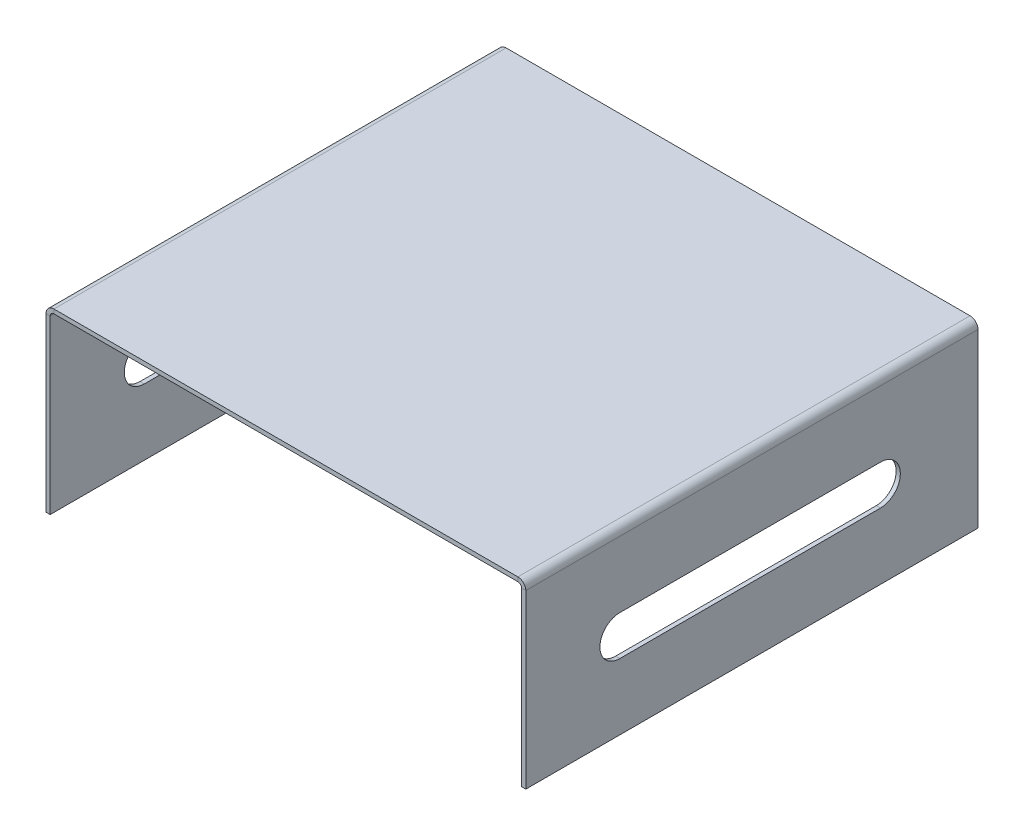
ISO-10303-21;
HEADER;
FILE_DESCRIPTION(('STEP AP214'),'2;1');
FILE_NAME('part.step','',(''),(''),'','','');
FILE_SCHEMA(('AUTOMOTIVE_DESIGN { 1 0 10303 214 1 1 1 1 }'));
ENDSEC;
DATA;
#1=APPLICATION_CONTEXT('core data for automotive mechanical design processes');
#2=APPLICATION_PROTOCOL_DEFINITION('international standard','automotive_design',2000,#1);
#3=PRODUCT_CONTEXT('',#1,'mechanical');
#4=PRODUCT('Part','Part','',(#3));
#5=PRODUCT_RELATED_PRODUCT_CATEGORY('part','',(#4));
#6=PRODUCT_DEFINITION_FORMATION('','',#4);
#7=PRODUCT_DEFINITION_CONTEXT('part definition',#1,'design');
#8=PRODUCT_DEFINITION('design','',#6,#7);
#9=PRODUCT_DEFINITION_SHAPE('','',#8);
#10=(LENGTH_UNIT() NAMED_UNIT(*) SI_UNIT(.MILLI.,.METRE.));
#11=(NAMED_UNIT(*) PLANE_ANGLE_UNIT() SI_UNIT($,.RADIAN.));
#12=(NAMED_UNIT(*) SI_UNIT($,.STERADIAN.) SOLID_ANGLE_UNIT());
#13=UNCERTAINTY_MEASURE_WITH_UNIT(LENGTH_MEASURE(1.E-05),#10,'distance_accuracy_value','');
#14=(GEOMETRIC_REPRESENTATION_CONTEXT(3) GLOBAL_UNCERTAINTY_ASSIGNED_CONTEXT((#13)) GLOBAL_UNIT_ASSIGNED_CONTEXT((#10,
#11,#12)) REPRESENTATION_CONTEXT('',''));
#15=CARTESIAN_POINT('',(0.,0.,0.));
#16=DIRECTION('',(0.,0.,1.));
#17=DIRECTION('',(1.,0.,0.));
#18=AXIS2_PLACEMENT_3D('',#15,#16,#17);
#19=CARTESIAN_POINT('',(0.889,0.,-95.758));
#20=DIRECTION('',(1.,0.,0.));
#21=DIRECTION('',(0.,0.,-1.));
#22=AXIS2_PLACEMENT_3D('',#19,#20,#21);
#23=PLANE('',#22);
#24=DIRECTION('',(0.,1.,0.));
#25=VECTOR('',#24,1.);
#26=CARTESIAN_POINT('',(0.889,0.,0.));
#27=LINE('',#26,#25);
#28=CARTESIAN_POINT('',(0.889,0.,0.));
#29=VERTEX_POINT('',#28);
#30=CARTESIAN_POINT('',(0.889,36.4236,0.));
#31=VERTEX_POINT('',#30);
#32=EDGE_CURVE('E295',#29,#31,#27,.T.);
#33=ORIENTED_EDGE('',*,*,#32,.F.);
#34=DIRECTION('',(0.,0.,1.));
#35=VECTOR('',#34,1.);
#36=CARTESIAN_POINT('',(0.889,0.,-95.758));
#37=LINE('',#36,#35);
#38=CARTESIAN_POINT('',(0.889,0.,-95.758));
#39=VERTEX_POINT('',#38);
#40=EDGE_CURVE('E319',#39,#29,#37,.T.);
#41=ORIENTED_EDGE('',*,*,#40,.F.);
#42=DIRECTION('',(0.,1.,0.));
#43=VECTOR('',#42,1.);
#44=CARTESIAN_POINT('',(0.889,0.,-95.758));
#45=LINE('',#44,#43);
#46=CARTESIAN_POINT('',(0.889,36.4236,-95.758));
#47=VERTEX_POINT('',#46);
#48=EDGE_CURVE('E261',#39,#47,#45,.T.);
#49=ORIENTED_EDGE('',*,*,#48,.T.);
#50=DIRECTION('',(0.,0.,1.));
#51=VECTOR('',#50,1.);
#52=CARTESIAN_POINT('',(0.889,36.4236,-95.758));
#53=LINE('',#52,#51);
#54=EDGE_CURVE('E316',#47,#31,#53,.T.);
#55=ORIENTED_EDGE('',*,*,#54,.T.);
#56=EDGE_LOOP('',(#33,#41,#49,#55));
#57=FACE_BOUND('',#56,.T.);
#58=DIRECTION('',(0.,0.,1.));
#59=VECTOR('',#58,1.);
#60=CARTESIAN_POINT('',(0.889,14.0030326493165,-95.758));
#61=LINE('',#60,#59);
#62=CARTESIAN_POINT('',(0.889,14.0030326493165,-75.100409008472));
#63=VERTEX_POINT('',#62);
#64=CARTESIAN_POINT('',(0.889,14.0030326493165,-19.9059150031284));
#65=VERTEX_POINT('',#64);
#66=EDGE_CURVE('E232',#63,#65,#61,.T.);
#67=ORIENTED_EDGE('',*,*,#66,.T.);
#68=CARTESIAN_POINT('',(0.889,18.2118,-19.9059150031284));
#69=DIRECTION('',(1.,0.,0.));
#70=DIRECTION('',(0.,0.,-1.));
#71=AXIS2_PLACEMENT_3D('',#68,#69,#70);
#72=CIRCLE('',#71,4.20876735068352);
#73=CARTESIAN_POINT('',(0.889,22.4205673506835,-19.9059150031284));
#74=VERTEX_POINT('',#73);
#75=EDGE_CURVE('E235',#65,#74,#72,.F.);
#76=ORIENTED_EDGE('',*,*,#75,.T.);
#77=DIRECTION('',(0.,0.,-1.));
#78=VECTOR('',#77,1.);
#79=CARTESIAN_POINT('',(0.889,22.4205673506835,-95.758));
#80=LINE('',#79,#78);
#81=CARTESIAN_POINT('',(0.889,22.4205673506835,-75.100409008472));
#82=VERTEX_POINT('',#81);
#83=EDGE_CURVE('E226',#74,#82,#80,.T.);
#84=ORIENTED_EDGE('',*,*,#83,.T.);
#85=CARTESIAN_POINT('',(0.889,18.2118,-75.100409008472));
#86=DIRECTION('',(1.,0.,0.));
#87=DIRECTION('',(0.,0.,-1.));
#88=AXIS2_PLACEMENT_3D('',#85,#86,#87);
#89=CIRCLE('',#88,4.20876735068352);
#90=EDGE_CURVE('E229',#82,#63,#89,.F.);
#91=ORIENTED_EDGE('',*,*,#90,.T.);
#92=EDGE_LOOP('',(#67,#76,#84,#91));
#93=FACE_BOUND('',#92,.T.);
#94=ADVANCED_FACE('F33',(#57,#93),#23,.T.);
#95=CARTESIAN_POINT('',(0.,0.,-95.758));
#96=DIRECTION('',(1.,0.,0.));
#97=DIRECTION('',(0.,0.,-1.));
#98=AXIS2_PLACEMENT_3D('',#95,#96,#97);
#99=PLANE('',#98);
#100=DIRECTION('',(0.,1.,0.));
#101=VECTOR('',#100,1.);
#102=CARTESIAN_POINT('',(0.,0.,0.));
#103=LINE('',#102,#101);
#104=CARTESIAN_POINT('',(0.,0.,0.));
#105=VERTEX_POINT('',#104);
#106=CARTESIAN_POINT('',(0.,36.4236,0.));
#107=VERTEX_POINT('',#106);
#108=EDGE_CURVE('E290',#105,#107,#103,.T.);
#109=ORIENTED_EDGE('',*,*,#108,.T.);
#110=DIRECTION('',(0.,0.,1.));
#111=VECTOR('',#110,1.);
#112=CARTESIAN_POINT('',(0.,36.4236,-95.758));
#113=LINE('',#112,#111);
#114=CARTESIAN_POINT('',(0.,36.4236,-95.758));
#115=VERTEX_POINT('',#114);
#116=EDGE_CURVE('E324',#115,#107,#113,.T.);
#117=ORIENTED_EDGE('',*,*,#116,.F.);
#118=DIRECTION('',(0.,1.,0.));
#119=VECTOR('',#118,1.);
#120=CARTESIAN_POINT('',(0.,0.,-95.758));
#121=LINE('',#120,#119);
#122=CARTESIAN_POINT('',(0.,0.,-95.758));
#123=VERTEX_POINT('',#122);
#124=EDGE_CURVE('E256',#123,#115,#121,.T.);
#125=ORIENTED_EDGE('',*,*,#124,.F.);
#126=DIRECTION('',(0.,0.,1.));
#127=VECTOR('',#126,1.);
#128=CARTESIAN_POINT('',(0.,0.,-95.758));
#129=LINE('',#128,#127);
#130=EDGE_CURVE('E321',#123,#105,#129,.T.);
#131=ORIENTED_EDGE('',*,*,#130,.T.);
#132=EDGE_LOOP('',(#109,#117,#125,#131));
#133=FACE_BOUND('',#132,.T.);
#134=CARTESIAN_POINT('',(0.,18.2118,-19.9059150031284));
#135=DIRECTION('',(1.,0.,0.));
#136=DIRECTION('',(0.,0.,-1.));
#137=AXIS2_PLACEMENT_3D('',#134,#135,#136);
#138=CIRCLE('',#137,4.20876735068352);
#139=CARTESIAN_POINT('',(0.,22.4205673506835,-19.9059150031284));
#140=VERTEX_POINT('',#139);
#141=CARTESIAN_POINT('',(0.,14.0030326493165,-19.9059150031284));
#142=VERTEX_POINT('',#141);
#143=EDGE_CURVE('E205',#140,#142,#138,.T.);
#144=ORIENTED_EDGE('',*,*,#143,.T.);
#145=DIRECTION('',(0.,0.,-1.));
#146=VECTOR('',#145,1.);
#147=CARTESIAN_POINT('',(0.,14.0030326493165,-19.9059150031284));
#148=LINE('',#147,#146);
#149=CARTESIAN_POINT('',(0.,14.0030326493165,-75.100409008472));
#150=VERTEX_POINT('',#149);
#151=EDGE_CURVE('E208',#142,#150,#148,.T.);
#152=ORIENTED_EDGE('',*,*,#151,.T.);
#153=CARTESIAN_POINT('',(0.,18.2118,-75.100409008472));
#154=DIRECTION('',(1.,0.,0.));
#155=DIRECTION('',(0.,0.,-1.));
#156=AXIS2_PLACEMENT_3D('',#153,#154,#155);
#157=CIRCLE('',#156,4.20876735068352);
#158=CARTESIAN_POINT('',(0.,22.4205673506835,-75.100409008472));
#159=VERTEX_POINT('',#158);
#160=EDGE_CURVE('E211',#150,#159,#157,.T.);
#161=ORIENTED_EDGE('',*,*,#160,.T.);
#162=DIRECTION('',(0.,0.,1.));
#163=VECTOR('',#162,1.);
#164=CARTESIAN_POINT('',(0.,22.4205673506835,-19.9059150031284));
#165=LINE('',#164,#163);
#166=EDGE_CURVE('E214',#159,#140,#165,.T.);
#167=ORIENTED_EDGE('',*,*,#166,.T.);
#168=EDGE_LOOP('',(#144,#152,#161,#167));
#169=FACE_BOUND('',#168,.T.);
#170=ADVANCED_FACE('F398',(#133,#169),#99,.F.);
#171=CARTESIAN_POINT('',(0.,36.4236,-95.758));
#172=DIRECTION('',(0.,0.,-1.));
#173=DIRECTION('',(-1.,0.,0.));
#174=AXIS2_PLACEMENT_3D('',#171,#172,#173);
#175=PLANE('',#174);
#176=DIRECTION('',(1.,0.,0.));
#177=VECTOR('',#176,1.);
#178=CARTESIAN_POINT('',(0.,36.4236,-95.758));
#179=LINE('',#178,#177);
#180=EDGE_CURVE('E11',#115,#47,#179,.T.);
#181=ORIENTED_EDGE('',*,*,#180,.F.);
#182=CARTESIAN_POINT('',(1.6764,36.4236,-95.758));
#183=DIRECTION('',(0.,0.,1.));
#184=DIRECTION('',(1.,0.,0.));
#185=AXIS2_PLACEMENT_3D('',#182,#183,#184);
#186=CIRCLE('',#185,1.6764);
#187=CARTESIAN_POINT('',(1.6764,38.1,-95.758));
#188=VERTEX_POINT('',#187);
#189=EDGE_CURVE('E253',#115,#188,#186,.F.);
#190=ORIENTED_EDGE('',*,*,#189,.T.);
#191=DIRECTION('',(0.,1.,0.));
#192=VECTOR('',#191,1.);
#193=CARTESIAN_POINT('',(1.6764,37.211,-95.758));
#194=LINE('',#193,#192);
#195=CARTESIAN_POINT('',(1.6764,37.211,-95.758));
#196=VERTEX_POINT('',#195);
#197=EDGE_CURVE('E41',#196,#188,#194,.T.);
#198=ORIENTED_EDGE('',*,*,#197,.F.);
#199=CARTESIAN_POINT('',(1.6764,36.4236,-95.758));
#200=DIRECTION('',(0.,0.,1.));
#201=DIRECTION('',(1.,0.,0.));
#202=AXIS2_PLACEMENT_3D('',#199,#200,#201);
#203=CIRCLE('',#202,0.7874);
#204=EDGE_CURVE('E264',#47,#196,#203,.F.);
#205=ORIENTED_EDGE('',*,*,#204,.F.);
#206=EDGE_LOOP('',(#181,#190,#198,#205));
#207=FACE_BOUND('',#206,.T.);
#208=ADVANCED_FACE('F35',(#207),#175,.T.);
#209=CARTESIAN_POINT('',(1.6764,37.211,-95.758));
#210=DIRECTION('',(0.,0.,-1.));
#211=DIRECTION('',(-1.,0.,0.));
#212=AXIS2_PLACEMENT_3D('',#209,#210,#211);
#213=PLANE('',#212);
#214=ORIENTED_EDGE('',*,*,#124,.T.);
#215=ORIENTED_EDGE('',*,*,#180,.T.);
#216=ORIENTED_EDGE('',*,*,#48,.F.);
#217=DIRECTION('',(-1.,0.,0.));
#218=VECTOR('',#217,1.);
#219=CARTESIAN_POINT('',(0.889,0.,-95.758));
#220=LINE('',#219,#218);
#221=EDGE_CURVE('E259',#39,#123,#220,.T.);
#222=ORIENTED_EDGE('',*,*,#221,.T.);
#223=EDGE_LOOP('',(#214,#215,#216,#222));
#224=FACE_BOUND('',#223,.T.);
#225=ADVANCED_FACE('F393',(#224),#213,.T.);
#226=CARTESIAN_POINT('',(1.6764,38.1,0.));
#227=DIRECTION('',(0.,0.,1.));
#228=DIRECTION('',(1.,0.,0.));
#229=AXIS2_PLACEMENT_3D('',#226,#227,#228);
#230=PLANE('',#229);
#231=DIRECTION('',(0.,-1.,0.));
#232=VECTOR('',#231,1.);
#233=CARTESIAN_POINT('',(1.6764,38.1,0.));
#234=LINE('',#233,#232);
#235=CARTESIAN_POINT('',(1.6764,38.1,0.));
#236=VERTEX_POINT('',#235);
#237=CARTESIAN_POINT('',(1.6764,37.211,0.));
#238=VERTEX_POINT('',#237);
#239=EDGE_CURVE('E349',#236,#238,#234,.T.);
#240=ORIENTED_EDGE('',*,*,#239,.F.);
#241=CARTESIAN_POINT('',(1.6764,36.4236,0.));
#242=DIRECTION('',(0.,0.,1.));
#243=DIRECTION('',(1.,0.,0.));
#244=AXIS2_PLACEMENT_3D('',#241,#242,#243);
#245=CIRCLE('',#244,1.6764);
#246=EDGE_CURVE('E287',#107,#236,#245,.F.);
#247=ORIENTED_EDGE('',*,*,#246,.F.);
#248=DIRECTION('',(-1.,0.,0.));
#249=VECTOR('',#248,1.);
#250=CARTESIAN_POINT('',(0.889,36.4236,0.));
#251=LINE('',#250,#249);
#252=EDGE_CURVE('E347',#31,#107,#251,.T.);
#253=ORIENTED_EDGE('',*,*,#252,.F.);
#254=CARTESIAN_POINT('',(1.6764,36.4236,0.));
#255=DIRECTION('',(0.,0.,1.));
#256=DIRECTION('',(1.,0.,0.));
#257=AXIS2_PLACEMENT_3D('',#254,#255,#256);
#258=CIRCLE('',#257,0.7874);
#259=EDGE_CURVE('E298',#31,#238,#258,.F.);
#260=ORIENTED_EDGE('',*,*,#259,.T.);
#261=EDGE_LOOP('',(#240,#247,#253,#260));
#262=FACE_BOUND('',#261,.T.);
#263=ADVANCED_FACE('F402',(#262),#230,.T.);
#264=CARTESIAN_POINT('',(0.889,36.4236,0.));
#265=DIRECTION('',(0.,0.,1.));
#266=DIRECTION('',(1.,0.,0.));
#267=AXIS2_PLACEMENT_3D('',#264,#265,#266);
#268=PLANE('',#267);
#269=DIRECTION('',(1.,0.,0.));
#270=VECTOR('',#269,1.);
#271=CARTESIAN_POINT('',(0.,38.1,0.));
#272=LINE('',#271,#270);
#273=CARTESIAN_POINT('',(99.9236,38.1,0.));
#274=VERTEX_POINT('',#273);
#275=EDGE_CURVE('E284',#236,#274,#272,.T.);
#276=ORIENTED_EDGE('',*,*,#275,.F.);
#277=ORIENTED_EDGE('',*,*,#239,.T.);
#278=DIRECTION('',(1.,0.,0.));
#279=VECTOR('',#278,1.);
#280=CARTESIAN_POINT('',(0.,37.211,0.));
#281=LINE('',#280,#279);
#282=CARTESIAN_POINT('',(99.9236,37.211,0.));
#283=VERTEX_POINT('',#282);
#284=EDGE_CURVE('E301',#238,#283,#281,.T.);
#285=ORIENTED_EDGE('',*,*,#284,.T.);
#286=DIRECTION('',(0.,1.,0.));
#287=VECTOR('',#286,1.);
#288=CARTESIAN_POINT('',(99.9236,37.211,0.));
#289=LINE('',#288,#287);
#290=EDGE_CURVE('E309',#283,#274,#289,.T.);
#291=ORIENTED_EDGE('',*,*,#290,.T.);
#292=EDGE_LOOP('',(#276,#277,#285,#291));
#293=FACE_BOUND('',#292,.T.);
#294=ADVANCED_FACE('F404',(#293),#268,.T.);
#295=CARTESIAN_POINT('',(99.9236,38.1,-95.758));
#296=DIRECTION('',(0.,0.,-1.));
#297=DIRECTION('',(-1.,0.,0.));
#298=AXIS2_PLACEMENT_3D('',#295,#296,#297);
#299=PLANE('',#298);
#300=DIRECTION('',(0.,-1.,0.));
#301=VECTOR('',#300,1.);
#302=CARTESIAN_POINT('',(99.9236,38.1,-95.758));
#303=LINE('',#302,#301);
#304=CARTESIAN_POINT('',(99.9236,38.1,-95.758));
#305=VERTEX_POINT('',#304);
#306=CARTESIAN_POINT('',(99.9236,37.211,-95.758));
#307=VERTEX_POINT('',#306);
#308=EDGE_CURVE('E345',#305,#307,#303,.T.);
#309=ORIENTED_EDGE('',*,*,#308,.F.);
#310=CARTESIAN_POINT('',(99.9236,36.4236,-95.758));
#311=DIRECTION('',(0.,0.,1.));
#312=DIRECTION('',(1.,0.,0.));
#313=AXIS2_PLACEMENT_3D('',#310,#311,#312);
#314=CIRCLE('',#313,1.6764);
#315=CARTESIAN_POINT('',(101.6,36.4236,-95.758));
#316=VERTEX_POINT('',#315);
#317=EDGE_CURVE('E247',#305,#316,#314,.F.);
#318=ORIENTED_EDGE('',*,*,#317,.T.);
#319=DIRECTION('',(1.,0.,0.));
#320=VECTOR('',#319,1.);
#321=CARTESIAN_POINT('',(100.711,36.4236,-95.758));
#322=LINE('',#321,#320);
#323=CARTESIAN_POINT('',(100.711,36.4236,-95.758));
#324=VERTEX_POINT('',#323);
#325=EDGE_CURVE('E343',#324,#316,#322,.T.);
#326=ORIENTED_EDGE('',*,*,#325,.F.);
#327=CARTESIAN_POINT('',(99.9236,36.4236,-95.758));
#328=DIRECTION('',(0.,0.,1.));
#329=DIRECTION('',(1.,0.,0.));
#330=AXIS2_PLACEMENT_3D('',#327,#328,#329);
#331=CIRCLE('',#330,0.7874);
#332=EDGE_CURVE('E270',#307,#324,#331,.F.);
#333=ORIENTED_EDGE('',*,*,#332,.F.);
#334=EDGE_LOOP('',(#309,#318,#326,#333));
#335=FACE_BOUND('',#334,.T.);
#336=ADVANCED_FACE('F373',(#335),#299,.T.);
#337=CARTESIAN_POINT('',(100.711,36.4236,-95.758));
#338=DIRECTION('',(0.,0.,-1.));
#339=DIRECTION('',(-1.,0.,0.));
#340=AXIS2_PLACEMENT_3D('',#337,#338,#339);
#341=PLANE('',#340);
#342=DIRECTION('',(1.,0.,0.));
#343=VECTOR('',#342,1.);
#344=CARTESIAN_POINT('',(0.,38.1,-95.758));
#345=LINE('',#344,#343);
#346=EDGE_CURVE('E250',#188,#305,#345,.T.);
#347=ORIENTED_EDGE('',*,*,#346,.T.);
#348=ORIENTED_EDGE('',*,*,#308,.T.);
#349=DIRECTION('',(1.,0.,0.));
#350=VECTOR('',#349,1.);
#351=CARTESIAN_POINT('',(0.,37.211,-95.758));
#352=LINE('',#351,#350);
#353=EDGE_CURVE('E267',#196,#307,#352,.T.);
#354=ORIENTED_EDGE('',*,*,#353,.F.);
#355=ORIENTED_EDGE('',*,*,#197,.T.);
#356=EDGE_LOOP('',(#347,#348,#354,#355));
#357=FACE_BOUND('',#356,.T.);
#358=ADVANCED_FACE('F352',(#357),#341,.T.);
#359=CARTESIAN_POINT('',(101.6,36.4236,0.));
#360=DIRECTION('',(0.,0.,1.));
#361=DIRECTION('',(1.,0.,0.));
#362=AXIS2_PLACEMENT_3D('',#359,#360,#361);
#363=PLANE('',#362);
#364=DIRECTION('',(-1.,0.,0.));
#365=VECTOR('',#364,1.);
#366=CARTESIAN_POINT('',(101.6,36.4236,0.));
#367=LINE('',#366,#365);
#368=CARTESIAN_POINT('',(101.6,36.4236,0.));
#369=VERTEX_POINT('',#368);
#370=CARTESIAN_POINT('',(100.711,36.4236,0.));
#371=VERTEX_POINT('',#370);
#372=EDGE_CURVE('E341',#369,#371,#367,.T.);
#373=ORIENTED_EDGE('',*,*,#372,.F.);
#374=CARTESIAN_POINT('',(99.9236,36.4236,0.));
#375=DIRECTION('',(0.,0.,1.));
#376=DIRECTION('',(1.,0.,0.));
#377=AXIS2_PLACEMENT_3D('',#374,#375,#376);
#378=CIRCLE('',#377,1.6764);
#379=EDGE_CURVE('E281',#274,#369,#378,.F.);
#380=ORIENTED_EDGE('',*,*,#379,.F.);
#381=ORIENTED_EDGE('',*,*,#290,.F.);
#382=CARTESIAN_POINT('',(99.9236,36.4236,0.));
#383=DIRECTION('',(0.,0.,1.));
#384=DIRECTION('',(1.,0.,0.));
#385=AXIS2_PLACEMENT_3D('',#382,#383,#384);
#386=CIRCLE('',#385,0.7874);
#387=EDGE_CURVE('E243',#283,#371,#386,.F.);
#388=ORIENTED_EDGE('',*,*,#387,.T.);
#389=EDGE_LOOP('',(#373,#380,#381,#388));
#390=FACE_BOUND('',#389,.T.);
#391=ADVANCED_FACE('F406',(#390),#363,.T.);
#392=CARTESIAN_POINT('',(99.9236,37.211,0.));
#393=DIRECTION('',(0.,0.,1.));
#394=DIRECTION('',(1.,0.,0.));
#395=AXIS2_PLACEMENT_3D('',#392,#393,#394);
#396=PLANE('',#395);
#397=DIRECTION('',(0.,-1.,0.));
#398=VECTOR('',#397,1.);
#399=CARTESIAN_POINT('',(101.6,38.1,0.));
#400=LINE('',#399,#398);
#401=CARTESIAN_POINT('',(101.6,0.,0.));
#402=VERTEX_POINT('',#401);
#403=EDGE_CURVE('E279',#369,#402,#400,.T.);
#404=ORIENTED_EDGE('',*,*,#403,.F.);
#405=ORIENTED_EDGE('',*,*,#372,.T.);
#406=DIRECTION('',(0.,-1.,0.));
#407=VECTOR('',#406,1.);
#408=CARTESIAN_POINT('',(100.711,38.1,0.));
#409=LINE('',#408,#407);
#410=CARTESIAN_POINT('',(100.711,0.,0.));
#411=VERTEX_POINT('',#410);
#412=EDGE_CURVE('E238',#371,#411,#409,.T.);
#413=ORIENTED_EDGE('',*,*,#412,.T.);
#414=DIRECTION('',(-1.,0.,0.));
#415=VECTOR('',#414,1.);
#416=CARTESIAN_POINT('',(101.6,0.,0.));
#417=LINE('',#416,#415);
#418=EDGE_CURVE('E276',#402,#411,#417,.T.);
#419=ORIENTED_EDGE('',*,*,#418,.F.);
#420=EDGE_LOOP('',(#404,#405,#413,#419));
#421=FACE_BOUND('',#420,.T.);
#422=ADVANCED_FACE('F411',(#421),#396,.T.);
#423=CARTESIAN_POINT('',(100.711,38.1,-95.758));
#424=DIRECTION('',(-1.,0.,0.));
#425=DIRECTION('',(0.,-1.,0.));
#426=AXIS2_PLACEMENT_3D('',#423,#424,#425);
#427=PLANE('',#426);
#428=CARTESIAN_POINT('',(100.711,18.2118,-19.9059150031284));
#429=DIRECTION('',(-1.,0.,0.));
#430=DIRECTION('',(0.,-1.,0.));
#431=AXIS2_PLACEMENT_3D('',#428,#429,#430);
#432=CIRCLE('',#431,4.20876735068352);
#433=CARTESIAN_POINT('',(100.711,14.0030326493165,-19.9059150031284));
#434=VERTEX_POINT('',#433);
#435=CARTESIAN_POINT('',(100.711,22.4205673506835,-19.9059150031284));
#436=VERTEX_POINT('',#435);
#437=EDGE_CURVE('E172',#434,#436,#432,.T.);
#438=ORIENTED_EDGE('',*,*,#437,.F.);
#439=DIRECTION('',(0.,0.,1.));
#440=VECTOR('',#439,1.);
#441=CARTESIAN_POINT('',(100.711,14.0030326493165,-95.758));
#442=LINE('',#441,#440);
#443=CARTESIAN_POINT('',(100.711,14.0030326493165,-75.100409008472));
#444=VERTEX_POINT('',#443);
#445=EDGE_CURVE('E175',#444,#434,#442,.T.);
#446=ORIENTED_EDGE('',*,*,#445,.F.);
#447=CARTESIAN_POINT('',(100.711,18.2118,-75.100409008472));
#448=DIRECTION('',(-1.,0.,0.));
#449=DIRECTION('',(0.,-1.,0.));
#450=AXIS2_PLACEMENT_3D('',#447,#448,#449);
#451=CIRCLE('',#450,4.20876735068352);
#452=CARTESIAN_POINT('',(100.711,22.4205673506835,-75.100409008472));
#453=VERTEX_POINT('',#452);
#454=EDGE_CURVE('E200',#453,#444,#451,.T.);
#455=ORIENTED_EDGE('',*,*,#454,.F.);
#456=DIRECTION('',(0.,0.,-1.));
#457=VECTOR('',#456,1.);
#458=CARTESIAN_POINT('',(100.711,22.4205673506835,-95.758));
#459=LINE('',#458,#457);
#460=EDGE_CURVE('E202',#436,#453,#459,.T.);
#461=ORIENTED_EDGE('',*,*,#460,.F.);
#462=EDGE_LOOP('',(#438,#446,#455,#461));
#463=FACE_BOUND('',#462,.T.);
#464=ORIENTED_EDGE('',*,*,#412,.F.);
#465=DIRECTION('',(0.,0.,1.));
#466=VECTOR('',#465,1.);
#467=CARTESIAN_POINT('',(100.711,36.4236,-95.758));
#468=LINE('',#467,#466);
#469=EDGE_CURVE('E306',#324,#371,#468,.T.);
#470=ORIENTED_EDGE('',*,*,#469,.F.);
#471=DIRECTION('',(0.,-1.,0.));
#472=VECTOR('',#471,1.);
#473=CARTESIAN_POINT('',(100.711,38.1,-95.758));
#474=LINE('',#473,#472);
#475=CARTESIAN_POINT('',(100.711,0.,-95.758));
#476=VERTEX_POINT('',#475);
#477=EDGE_CURVE('E239',#324,#476,#474,.T.);
#478=ORIENTED_EDGE('',*,*,#477,.T.);
#479=DIRECTION('',(0.,0.,1.));
#480=VECTOR('',#479,1.);
#481=CARTESIAN_POINT('',(100.711,0.,-95.758));
#482=LINE('',#481,#480);
#483=EDGE_CURVE('E273',#476,#411,#482,.T.);
#484=ORIENTED_EDGE('',*,*,#483,.T.);
#485=EDGE_LOOP('',(#464,#470,#478,#484));
#486=FACE_BOUND('',#485,.T.);
#487=ADVANCED_FACE('F421',(#463,#486),#427,.T.);
#488=CARTESIAN_POINT('',(99.9236,36.4236,-95.758));
#489=DIRECTION('',(0.,0.,1.));
#490=DIRECTION('',(1.,0.,0.));
#491=AXIS2_PLACEMENT_3D('',#488,#489,#490);
#492=CYLINDRICAL_SURFACE('',#491,0.7874);
#493=ORIENTED_EDGE('',*,*,#387,.F.);
#494=DIRECTION('',(0.,0.,1.));
#495=VECTOR('',#494,1.);
#496=CARTESIAN_POINT('',(99.9236,37.211,-95.758));
#497=LINE('',#496,#495);
#498=EDGE_CURVE('E310',#307,#283,#497,.T.);
#499=ORIENTED_EDGE('',*,*,#498,.F.);
#500=ORIENTED_EDGE('',*,*,#332,.T.);
#501=ORIENTED_EDGE('',*,*,#469,.T.);
#502=EDGE_LOOP('',(#493,#499,#500,#501));
#503=FACE_BOUND('',#502,.T.);
#504=ADVANCED_FACE('F379',(#503),#492,.F.);
#505=CARTESIAN_POINT('',(0.,37.211,-95.758));
#506=DIRECTION('',(0.,-1.,0.));
#507=DIRECTION('',(0.,0.,-1.));
#508=AXIS2_PLACEMENT_3D('',#505,#506,#507);
#509=PLANE('',#508);
#510=ORIENTED_EDGE('',*,*,#284,.F.);
#511=DIRECTION('',(0.,0.,1.));
#512=VECTOR('',#511,1.);
#513=CARTESIAN_POINT('',(1.6764,37.211,-95.758));
#514=LINE('',#513,#512);
#515=EDGE_CURVE('E313',#196,#238,#514,.T.);
#516=ORIENTED_EDGE('',*,*,#515,.F.);
#517=ORIENTED_EDGE('',*,*,#353,.T.);
#518=ORIENTED_EDGE('',*,*,#498,.T.);
#519=EDGE_LOOP('',(#510,#516,#517,#518));
#520=FACE_BOUND('',#519,.T.);
#521=ADVANCED_FACE('F382',(#520),#509,.T.);
#522=CARTESIAN_POINT('',(1.6764,36.4236,-95.758));
#523=DIRECTION('',(0.,0.,1.));
#524=DIRECTION('',(1.,0.,0.));
#525=AXIS2_PLACEMENT_3D('',#522,#523,#524);
#526=CYLINDRICAL_SURFACE('',#525,0.7874);
#527=ORIENTED_EDGE('',*,*,#259,.F.);
#528=ORIENTED_EDGE('',*,*,#54,.F.);
#529=ORIENTED_EDGE('',*,*,#204,.T.);
#530=ORIENTED_EDGE('',*,*,#515,.T.);
#531=EDGE_LOOP('',(#527,#528,#529,#530));
#532=FACE_BOUND('',#531,.T.);
#533=ADVANCED_FACE('F385',(#532),#526,.F.);
#534=CARTESIAN_POINT('',(0.889,0.,-95.758));
#535=DIRECTION('',(0.,1.,0.));
#536=DIRECTION('',(0.,0.,1.));
#537=AXIS2_PLACEMENT_3D('',#534,#535,#536);
#538=PLANE('',#537);
#539=DIRECTION('',(-1.,0.,0.));
#540=VECTOR('',#539,1.);
#541=CARTESIAN_POINT('',(0.889,0.,0.));
#542=LINE('',#541,#540);
#543=EDGE_CURVE('E293',#29,#105,#542,.T.);
#544=ORIENTED_EDGE('',*,*,#543,.T.);
#545=ORIENTED_EDGE('',*,*,#130,.F.);
#546=ORIENTED_EDGE('',*,*,#221,.F.);
#547=ORIENTED_EDGE('',*,*,#40,.T.);
#548=EDGE_LOOP('',(#544,#545,#546,#547));
#549=FACE_BOUND('',#548,.T.);
#550=ADVANCED_FACE('F441',(#549),#538,.F.);
#551=CARTESIAN_POINT('',(1.6764,36.4236,-95.758));
#552=DIRECTION('',(0.,0.,1.));
#553=DIRECTION('',(1.,0.,0.));
#554=AXIS2_PLACEMENT_3D('',#551,#552,#553);
#555=CYLINDRICAL_SURFACE('',#554,1.6764);
#556=ORIENTED_EDGE('',*,*,#246,.T.);
#557=DIRECTION('',(0.,0.,1.));
#558=VECTOR('',#557,1.);
#559=CARTESIAN_POINT('',(1.6764,38.1,-95.758));
#560=LINE('',#559,#558);
#561=EDGE_CURVE('E327',#188,#236,#560,.T.);
#562=ORIENTED_EDGE('',*,*,#561,.F.);
#563=ORIENTED_EDGE('',*,*,#189,.F.);
#564=ORIENTED_EDGE('',*,*,#116,.T.);
#565=EDGE_LOOP('',(#556,#562,#563,#564));
#566=FACE_BOUND('',#565,.T.);
#567=ADVANCED_FACE('F361',(#566),#555,.T.);
#568=CARTESIAN_POINT('',(0.,38.1,-95.758));
#569=DIRECTION('',(0.,-1.,0.));
#570=DIRECTION('',(0.,0.,-1.));
#571=AXIS2_PLACEMENT_3D('',#568,#569,#570);
#572=PLANE('',#571);
#573=ORIENTED_EDGE('',*,*,#275,.T.);
#574=DIRECTION('',(0.,0.,1.));
#575=VECTOR('',#574,1.);
#576=CARTESIAN_POINT('',(99.9236,38.1,-95.758));
#577=LINE('',#576,#575);
#578=EDGE_CURVE('E330',#305,#274,#577,.T.);
#579=ORIENTED_EDGE('',*,*,#578,.F.);
#580=ORIENTED_EDGE('',*,*,#346,.F.);
#581=ORIENTED_EDGE('',*,*,#561,.T.);
#582=EDGE_LOOP('',(#573,#579,#580,#581));
#583=FACE_BOUND('',#582,.T.);
#584=ADVANCED_FACE('F365',(#583),#572,.F.);
#585=CARTESIAN_POINT('',(99.9236,36.4236,-95.758));
#586=DIRECTION('',(0.,0.,1.));
#587=DIRECTION('',(1.,0.,0.));
#588=AXIS2_PLACEMENT_3D('',#585,#586,#587);
#589=CYLINDRICAL_SURFACE('',#588,1.6764);
#590=ORIENTED_EDGE('',*,*,#379,.T.);
#591=DIRECTION('',(0.,0.,1.));
#592=VECTOR('',#591,1.);
#593=CARTESIAN_POINT('',(101.6,36.4236,-95.758));
#594=LINE('',#593,#592);
#595=EDGE_CURVE('E333',#316,#369,#594,.T.);
#596=ORIENTED_EDGE('',*,*,#595,.F.);
#597=ORIENTED_EDGE('',*,*,#317,.F.);
#598=ORIENTED_EDGE('',*,*,#578,.T.);
#599=EDGE_LOOP('',(#590,#596,#597,#598));
#600=FACE_BOUND('',#599,.T.);
#601=ADVANCED_FACE('F370',(#600),#589,.T.);
#602=CARTESIAN_POINT('',(101.6,38.1,-95.758));
#603=DIRECTION('',(-1.,0.,0.));
#604=DIRECTION('',(0.,-1.,0.));
#605=AXIS2_PLACEMENT_3D('',#602,#603,#604);
#606=PLANE('',#605);
#607=DIRECTION('',(0.,0.,-1.));
#608=VECTOR('',#607,1.);
#609=CARTESIAN_POINT('',(101.6,14.0030326493165,-19.9059150031284));
#610=LINE('',#609,#608);
#611=CARTESIAN_POINT('',(101.6,14.0030326493165,-19.9059150031284));
#612=VERTEX_POINT('',#611);
#613=CARTESIAN_POINT('',(101.6,14.0030326493165,-75.100409008472));
#614=VERTEX_POINT('',#613);
#615=EDGE_CURVE('E190',#612,#614,#610,.T.);
#616=ORIENTED_EDGE('',*,*,#615,.F.);
#617=CARTESIAN_POINT('',(101.6,18.2118,-19.9059150031284));
#618=DIRECTION('',(1.,0.,0.));
#619=DIRECTION('',(0.,0.,-1.));
#620=AXIS2_PLACEMENT_3D('',#617,#618,#619);
#621=CIRCLE('',#620,4.20876735068352);
#622=CARTESIAN_POINT('',(101.6,22.4205673506835,-19.9059150031284));
#623=VERTEX_POINT('',#622);
#624=EDGE_CURVE('E56',#623,#612,#621,.T.);
#625=ORIENTED_EDGE('',*,*,#624,.F.);
#626=DIRECTION('',(0.,0.,1.));
#627=VECTOR('',#626,1.);
#628=CARTESIAN_POINT('',(101.6,22.4205673506835,-19.9059150031284));
#629=LINE('',#628,#627);
#630=CARTESIAN_POINT('',(101.6,22.4205673506835,-75.100409008472));
#631=VERTEX_POINT('',#630);
#632=EDGE_CURVE('E179',#631,#623,#629,.T.);
#633=ORIENTED_EDGE('',*,*,#632,.F.);
#634=CARTESIAN_POINT('',(101.6,18.2118,-75.100409008472));
#635=DIRECTION('',(1.,0.,0.));
#636=DIRECTION('',(0.,0.,-1.));
#637=AXIS2_PLACEMENT_3D('',#634,#635,#636);
#638=CIRCLE('',#637,4.20876735068352);
#639=EDGE_CURVE('E185',#614,#631,#638,.T.);
#640=ORIENTED_EDGE('',*,*,#639,.F.);
#641=EDGE_LOOP('',(#616,#625,#633,#640));
#642=FACE_BOUND('',#641,.T.);
#643=ORIENTED_EDGE('',*,*,#403,.T.);
#644=DIRECTION('',(0.,0.,1.));
#645=VECTOR('',#644,1.);
#646=CARTESIAN_POINT('',(101.6,0.,-95.758));
#647=LINE('',#646,#645);
#648=CARTESIAN_POINT('',(101.6,0.,-95.758));
#649=VERTEX_POINT('',#648);
#650=EDGE_CURVE('E336',#649,#402,#647,.T.);
#651=ORIENTED_EDGE('',*,*,#650,.F.);
#652=DIRECTION('',(0.,-1.,0.));
#653=VECTOR('',#652,1.);
#654=CARTESIAN_POINT('',(101.6,38.1,-95.758));
#655=LINE('',#654,#653);
#656=EDGE_CURVE('E245',#316,#649,#655,.T.);
#657=ORIENTED_EDGE('',*,*,#656,.F.);
#658=ORIENTED_EDGE('',*,*,#595,.T.);
#659=EDGE_LOOP('',(#643,#651,#657,#658));
#660=FACE_BOUND('',#659,.T.);
#661=ADVANCED_FACE('F188',(#642,#660),#606,.F.);
#662=CARTESIAN_POINT('',(101.6,0.,-95.758));
#663=DIRECTION('',(0.,1.,0.));
#664=DIRECTION('',(0.,0.,1.));
#665=AXIS2_PLACEMENT_3D('',#662,#663,#664);
#666=PLANE('',#665);
#667=ORIENTED_EDGE('',*,*,#418,.T.);
#668=ORIENTED_EDGE('',*,*,#483,.F.);
#669=DIRECTION('',(-1.,0.,0.));
#670=VECTOR('',#669,1.);
#671=CARTESIAN_POINT('',(101.6,0.,-95.758));
#672=LINE('',#671,#670);
#673=EDGE_CURVE('E242',#649,#476,#672,.T.);
#674=ORIENTED_EDGE('',*,*,#673,.F.);
#675=ORIENTED_EDGE('',*,*,#650,.T.);
#676=EDGE_LOOP('',(#667,#668,#674,#675));
#677=FACE_BOUND('',#676,.T.);
#678=ADVANCED_FACE('F415',(#677),#666,.F.);
#679=CARTESIAN_POINT('',(99.9236,36.4236,-95.758));
#680=DIRECTION('',(0.,0.,1.));
#681=DIRECTION('',(1.,0.,0.));
#682=AXIS2_PLACEMENT_3D('',#679,#680,#681);
#683=PLANE('',#682);
#684=ORIENTED_EDGE('',*,*,#477,.F.);
#685=ORIENTED_EDGE('',*,*,#325,.T.);
#686=ORIENTED_EDGE('',*,*,#656,.T.);
#687=ORIENTED_EDGE('',*,*,#673,.T.);
#688=EDGE_LOOP('',(#684,#685,#686,#687));
#689=FACE_BOUND('',#688,.T.);
#690=ADVANCED_FACE('F419',(#689),#683,.F.);
#691=CARTESIAN_POINT('',(99.9236,36.4236,0.));
#692=DIRECTION('',(0.,0.,1.));
#693=DIRECTION('',(1.,0.,0.));
#694=AXIS2_PLACEMENT_3D('',#691,#692,#693);
#695=PLANE('',#694);
#696=ORIENTED_EDGE('',*,*,#32,.T.);
#697=ORIENTED_EDGE('',*,*,#252,.T.);
#698=ORIENTED_EDGE('',*,*,#108,.F.);
#699=ORIENTED_EDGE('',*,*,#543,.F.);
#700=EDGE_LOOP('',(#696,#697,#698,#699));
#701=FACE_BOUND('',#700,.T.);
#702=ADVANCED_FACE('F456',(#701),#695,.T.);
#703=CARTESIAN_POINT('',(2.54,18.2118,-19.9059150031284));
#704=DIRECTION('',(-1.,0.,0.));
#705=DIRECTION('',(0.,0.,1.));
#706=AXIS2_PLACEMENT_3D('',#703,#704,#705);
#707=CYLINDRICAL_SURFACE('',#706,4.20876735068352);
#708=DIRECTION('',(-1.,0.,0.));
#709=VECTOR('',#708,1.);
#710=CARTESIAN_POINT('',(2.54,14.0030326493165,-19.9059150031284));
#711=LINE('',#710,#709);
#712=EDGE_CURVE('E224',#65,#142,#711,.T.);
#713=ORIENTED_EDGE('',*,*,#712,.T.);
#714=ORIENTED_EDGE('',*,*,#143,.F.);
#715=DIRECTION('',(-1.,0.,0.));
#716=VECTOR('',#715,1.);
#717=CARTESIAN_POINT('',(2.54,22.4205673506835,-19.9059150031284));
#718=LINE('',#717,#716);
#719=EDGE_CURVE('E217',#74,#140,#718,.T.);
#720=ORIENTED_EDGE('',*,*,#719,.F.);
#721=ORIENTED_EDGE('',*,*,#75,.F.);
#722=EDGE_LOOP('',(#713,#714,#720,#721));
#723=FACE_BOUND('',#722,.T.);
#724=ADVANCED_FACE('F461',(#723),#707,.F.);
#725=CARTESIAN_POINT('',(2.54,14.0030326493165,-19.9059150031284));
#726=DIRECTION('',(0.,1.,0.));
#727=DIRECTION('',(0.,0.,1.));
#728=AXIS2_PLACEMENT_3D('',#725,#726,#727);
#729=PLANE('',#728);
#730=DIRECTION('',(-1.,0.,0.));
#731=VECTOR('',#730,1.);
#732=CARTESIAN_POINT('',(2.54,14.0030326493165,-75.100409008472));
#733=LINE('',#732,#731);
#734=EDGE_CURVE('E222',#63,#150,#733,.T.);
#735=ORIENTED_EDGE('',*,*,#734,.T.);
#736=ORIENTED_EDGE('',*,*,#151,.F.);
#737=ORIENTED_EDGE('',*,*,#712,.F.);
#738=ORIENTED_EDGE('',*,*,#66,.F.);
#739=EDGE_LOOP('',(#735,#736,#737,#738));
#740=FACE_BOUND('',#739,.T.);
#741=ADVANCED_FACE('F559',(#740),#729,.T.);
#742=CARTESIAN_POINT('',(2.54,18.2118,-75.100409008472));
#743=DIRECTION('',(-1.,0.,0.));
#744=DIRECTION('',(0.,0.,1.));
#745=AXIS2_PLACEMENT_3D('',#742,#743,#744);
#746=CYLINDRICAL_SURFACE('',#745,4.20876735068352);
#747=DIRECTION('',(-1.,0.,0.));
#748=VECTOR('',#747,1.);
#749=CARTESIAN_POINT('',(2.54,22.4205673506835,-75.100409008472));
#750=LINE('',#749,#748);
#751=EDGE_CURVE('E220',#82,#159,#750,.T.);
#752=ORIENTED_EDGE('',*,*,#751,.T.);
#753=ORIENTED_EDGE('',*,*,#160,.F.);
#754=ORIENTED_EDGE('',*,*,#734,.F.);
#755=ORIENTED_EDGE('',*,*,#90,.F.);
#756=EDGE_LOOP('',(#752,#753,#754,#755));
#757=FACE_BOUND('',#756,.T.);
#758=ADVANCED_FACE('F550',(#757),#746,.F.);
#759=CARTESIAN_POINT('',(2.54,22.4205673506835,-19.9059150031284));
#760=DIRECTION('',(0.,-1.,0.));
#761=DIRECTION('',(0.,0.,-1.));
#762=AXIS2_PLACEMENT_3D('',#759,#760,#761);
#763=PLANE('',#762);
#764=ORIENTED_EDGE('',*,*,#719,.T.);
#765=ORIENTED_EDGE('',*,*,#166,.F.);
#766=ORIENTED_EDGE('',*,*,#751,.F.);
#767=ORIENTED_EDGE('',*,*,#83,.F.);
#768=EDGE_LOOP('',(#764,#765,#766,#767));
#769=FACE_BOUND('',#768,.T.);
#770=ADVANCED_FACE('F506',(#769),#763,.T.);
#771=CARTESIAN_POINT('',(99.06,18.2118,-19.9059150031284));
#772=DIRECTION('',(1.,0.,0.));
#773=DIRECTION('',(0.,0.,-1.));
#774=AXIS2_PLACEMENT_3D('',#771,#772,#773);
#775=CYLINDRICAL_SURFACE('',#774,4.20876735068352);
#776=ORIENTED_EDGE('',*,*,#437,.T.);
#777=DIRECTION('',(1.,0.,0.));
#778=VECTOR('',#777,1.);
#779=CARTESIAN_POINT('',(99.06,22.4205673506835,-19.9059150031284));
#780=LINE('',#779,#778);
#781=EDGE_CURVE('E168',#436,#623,#780,.T.);
#782=ORIENTED_EDGE('',*,*,#781,.T.);
#783=ORIENTED_EDGE('',*,*,#624,.T.);
#784=DIRECTION('',(1.,0.,0.));
#785=VECTOR('',#784,1.);
#786=CARTESIAN_POINT('',(99.06,14.0030326493165,-19.9059150031284));
#787=LINE('',#786,#785);
#788=EDGE_CURVE('E195',#434,#612,#787,.T.);
#789=ORIENTED_EDGE('',*,*,#788,.F.);
#790=EDGE_LOOP('',(#776,#782,#783,#789));
#791=FACE_BOUND('',#790,.T.);
#792=ADVANCED_FACE('F170',(#791),#775,.F.);
#793=CARTESIAN_POINT('',(99.06,22.4205673506835,-19.9059150031284));
#794=DIRECTION('',(0.,1.,0.));
#795=DIRECTION('',(0.,0.,1.));
#796=AXIS2_PLACEMENT_3D('',#793,#794,#795);
#797=PLANE('',#796);
#798=ORIENTED_EDGE('',*,*,#460,.T.);
#799=DIRECTION('',(1.,0.,0.));
#800=VECTOR('',#799,1.);
#801=CARTESIAN_POINT('',(99.06,22.4205673506835,-75.100409008472));
#802=LINE('',#801,#800);
#803=EDGE_CURVE('E176',#453,#631,#802,.T.);
#804=ORIENTED_EDGE('',*,*,#803,.T.);
#805=ORIENTED_EDGE('',*,*,#632,.T.);
#806=ORIENTED_EDGE('',*,*,#781,.F.);
#807=EDGE_LOOP('',(#798,#804,#805,#806));
#808=FACE_BOUND('',#807,.T.);
#809=ADVANCED_FACE('F180',(#808),#797,.F.);
#810=CARTESIAN_POINT('',(99.06,18.2118,-75.100409008472));
#811=DIRECTION('',(1.,0.,0.));
#812=DIRECTION('',(0.,0.,-1.));
#813=AXIS2_PLACEMENT_3D('',#810,#811,#812);
#814=CYLINDRICAL_SURFACE('',#813,4.20876735068352);
#815=ORIENTED_EDGE('',*,*,#454,.T.);
#816=DIRECTION('',(1.,0.,0.));
#817=VECTOR('',#816,1.);
#818=CARTESIAN_POINT('',(99.06,14.0030326493165,-75.100409008472));
#819=LINE('',#818,#817);
#820=EDGE_CURVE('E48',#444,#614,#819,.T.);
#821=ORIENTED_EDGE('',*,*,#820,.T.);
#822=ORIENTED_EDGE('',*,*,#639,.T.);
#823=ORIENTED_EDGE('',*,*,#803,.F.);
#824=EDGE_LOOP('',(#815,#821,#822,#823));
#825=FACE_BOUND('',#824,.T.);
#826=ADVANCED_FACE('F518',(#825),#814,.F.);
#827=CARTESIAN_POINT('',(99.06,14.0030326493165,-19.9059150031284));
#828=DIRECTION('',(0.,-1.,0.));
#829=DIRECTION('',(0.,0.,-1.));
#830=AXIS2_PLACEMENT_3D('',#827,#828,#829);
#831=PLANE('',#830);
#832=ORIENTED_EDGE('',*,*,#445,.T.);
#833=ORIENTED_EDGE('',*,*,#788,.T.);
#834=ORIENTED_EDGE('',*,*,#615,.T.);
#835=ORIENTED_EDGE('',*,*,#820,.F.);
#836=EDGE_LOOP('',(#832,#833,#834,#835));
#837=FACE_BOUND('',#836,.T.);
#838=ADVANCED_FACE('F528',(#837),#831,.F.);
#839=CLOSED_SHELL('',(#94,#170,#208,#225,#263,#294,#336,#358,#391,#422,#487,#504,#521,#533,#550,
#567,#584,#601,#661,#678,#690,#702,#724,#741,#758,#770,#792,#809,#826,#838));
#840=MANIFOLD_SOLID_BREP('B2',#839);
#841=ADVANCED_BREP_SHAPE_REPRESENTATION('',(#18,#840),#14);
#842=SHAPE_DEFINITION_REPRESENTATION(#9,#841);
ENDSEC;
END-ISO-10303-21;
